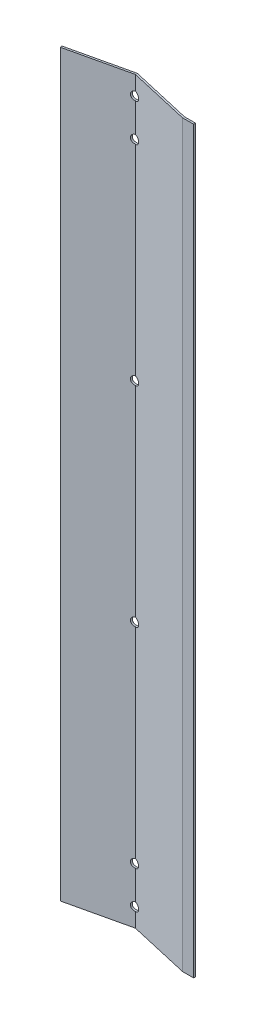
ISO-10303-21;
HEADER;
FILE_DESCRIPTION(('STEP AP214'),'2;1');
FILE_NAME('part.step','',(''),(''),'','','');
FILE_SCHEMA(('AUTOMOTIVE_DESIGN { 1 0 10303 214 1 1 1 1 }'));
ENDSEC;
DATA;
#1=APPLICATION_CONTEXT('core data for automotive mechanical design processes');
#2=APPLICATION_PROTOCOL_DEFINITION('international standard','automotive_design',2000,#1);
#3=PRODUCT_CONTEXT('',#1,'mechanical');
#4=PRODUCT('Part','Part','',(#3));
#5=PRODUCT_RELATED_PRODUCT_CATEGORY('part','',(#4));
#6=PRODUCT_DEFINITION_FORMATION('','',#4);
#7=PRODUCT_DEFINITION_CONTEXT('part definition',#1,'design');
#8=PRODUCT_DEFINITION('design','',#6,#7);
#9=PRODUCT_DEFINITION_SHAPE('','',#8);
#10=(LENGTH_UNIT() NAMED_UNIT(*) SI_UNIT(.MILLI.,.METRE.));
#11=(NAMED_UNIT(*) PLANE_ANGLE_UNIT() SI_UNIT($,.RADIAN.));
#12=(NAMED_UNIT(*) SI_UNIT($,.STERADIAN.) SOLID_ANGLE_UNIT());
#13=UNCERTAINTY_MEASURE_WITH_UNIT(LENGTH_MEASURE(1.E-05),#10,'distance_accuracy_value','');
#14=(GEOMETRIC_REPRESENTATION_CONTEXT(3) GLOBAL_UNCERTAINTY_ASSIGNED_CONTEXT((#13)) GLOBAL_UNIT_ASSIGNED_CONTEXT((#10,
#11,#12)) REPRESENTATION_CONTEXT('',''));
#15=CARTESIAN_POINT('',(0.,0.,0.));
#16=DIRECTION('',(0.,0.,1.));
#17=DIRECTION('',(1.,0.,0.));
#18=AXIS2_PLACEMENT_3D('',#15,#16,#17);
#19=CARTESIAN_POINT('',(-506.627585226793,1975.,994.704780496736));
#20=DIRECTION('',(-1.,0.,0.));
#21=DIRECTION('',(0.,0.,1.));
#22=AXIS2_PLACEMENT_3D('',#19,#20,#21);
#23=PLANE('',#22);
#24=DIRECTION('',(0.,0.,-1.));
#25=VECTOR('',#24,1.);
#26=CARTESIAN_POINT('',(-506.627585226793,0.,994.704780496736));
#27=LINE('',#26,#25);
#28=CARTESIAN_POINT('',(-506.627585226793,0.,999.704780496736));
#29=VERTEX_POINT('',#28);
#30=CARTESIAN_POINT('',(-506.627585226793,0.,994.704780496736));
#31=VERTEX_POINT('',#30);
#32=EDGE_CURVE('E291',#29,#31,#27,.T.);
#33=ORIENTED_EDGE('',*,*,#32,.T.);
#34=DIRECTION('',(0.,-1.,0.));
#35=VECTOR('',#34,1.);
#36=CARTESIAN_POINT('',(-506.627585226793,1975.,994.704780496736));
#37=LINE('',#36,#35);
#38=CARTESIAN_POINT('',(-506.627585226793,1975.,994.704780496736));
#39=VERTEX_POINT('',#38);
#40=EDGE_CURVE('E205',#39,#31,#37,.T.);
#41=ORIENTED_EDGE('',*,*,#40,.F.);
#42=DIRECTION('',(0.,0.,-1.));
#43=VECTOR('',#42,1.);
#44=CARTESIAN_POINT('',(-506.627585226793,1975.,994.704780496736));
#45=LINE('',#44,#43);
#46=CARTESIAN_POINT('',(-506.627585226793,1975.,999.704780496736));
#47=VERTEX_POINT('',#46);
#48=EDGE_CURVE('E292',#47,#39,#45,.T.);
#49=ORIENTED_EDGE('',*,*,#48,.F.);
#50=DIRECTION('',(0.,-1.,0.));
#51=VECTOR('',#50,1.);
#52=CARTESIAN_POINT('',(-506.627585226793,1975.,999.704780496736));
#53=LINE('',#52,#51);
#54=EDGE_CURVE('E310',#47,#29,#53,.T.);
#55=ORIENTED_EDGE('',*,*,#54,.T.);
#56=EDGE_LOOP('',(#33,#41,#49,#55));
#57=FACE_BOUND('',#56,.T.);
#58=ADVANCED_FACE('F33',(#57),#23,.F.);
#59=CARTESIAN_POINT('',(-536.087738825627,1975.,994.704780496736));
#60=DIRECTION('',(0.,0.,1.));
#61=DIRECTION('',(1.,0.,0.));
#62=AXIS2_PLACEMENT_3D('',#59,#60,#61);
#63=PLANE('',#62);
#64=DIRECTION('',(-1.,0.,0.));
#65=VECTOR('',#64,1.);
#66=CARTESIAN_POINT('',(-536.087738825627,0.,994.704780496736));
#67=LINE('',#66,#65);
#68=CARTESIAN_POINT('',(-536.087738825627,0.,994.704780496736));
#69=VERTEX_POINT('',#68);
#70=EDGE_CURVE('E313',#31,#69,#67,.T.);
#71=ORIENTED_EDGE('',*,*,#70,.T.);
#72=DIRECTION('',(0.,-1.,0.));
#73=VECTOR('',#72,1.);
#74=CARTESIAN_POINT('',(-536.087738825627,1975.,994.704780496736));
#75=LINE('',#74,#73);
#76=CARTESIAN_POINT('',(-536.087738825627,1975.,994.704780496736));
#77=VERTEX_POINT('',#76);
#78=EDGE_CURVE('E199',#77,#69,#75,.T.);
#79=ORIENTED_EDGE('',*,*,#78,.F.);
#80=DIRECTION('',(-1.,0.,0.));
#81=VECTOR('',#80,1.);
#82=CARTESIAN_POINT('',(-536.087738825627,1975.,994.704780496736));
#83=LINE('',#82,#81);
#84=EDGE_CURVE('E295',#39,#77,#83,.T.);
#85=ORIENTED_EDGE('',*,*,#84,.F.);
#86=ORIENTED_EDGE('',*,*,#40,.T.);
#87=EDGE_LOOP('',(#71,#79,#85,#86));
#88=FACE_BOUND('',#87,.T.);
#89=ADVANCED_FACE('F361',(#88),#63,.F.);
#90=CARTESIAN_POINT('',(-699.627585226793,1975.,957.225806909489));
#91=DIRECTION('',(-0.223382340793169,0.,0.974730901234676));
#92=DIRECTION('',(0.974730901234677,0.,0.223382340793169));
#93=AXIS2_PLACEMENT_3D('',#90,#91,#92);
#94=PLANE('',#93);
#95=DIRECTION('',(0.,-1.,0.));
#96=VECTOR('',#95,1.);
#97=CARTESIAN_POINT('',(-699.627585226793,1975.,957.225806909489));
#98=LINE('',#97,#96);
#99=CARTESIAN_POINT('',(-699.627585226793,1914.,957.225806909489));
#100=VERTEX_POINT('',#99);
#101=CARTESIAN_POINT('',(-699.627585226793,1836.,957.225806909489));
#102=VERTEX_POINT('',#101);
#103=EDGE_CURVE('E194',#100,#102,#98,.T.);
#104=ORIENTED_EDGE('',*,*,#103,.F.);
#105=CARTESIAN_POINT('',(-699.627585226793,1925.,957.225806909489));
#106=DIRECTION('',(-0.223382340793169,0.,0.974730901234676));
#107=DIRECTION('',(-0.974730901234677,0.,-0.223382340793169));
#108=AXIS2_PLACEMENT_3D('',#105,#106,#107);
#109=ELLIPSE('',#108,11.2851659735692,11.);
#110=CARTESIAN_POINT('',(-699.627585226793,1936.,957.225806909489));
#111=VERTEX_POINT('',#110);
#112=EDGE_CURVE('E288',#100,#111,#109,.T.);
#113=ORIENTED_EDGE('',*,*,#112,.T.);
#114=CARTESIAN_POINT('',(-699.627585226793,1975.,957.225806909489));
#115=VERTEX_POINT('',#114);
#116=EDGE_CURVE('E196',#115,#111,#98,.T.);
#117=ORIENTED_EDGE('',*,*,#116,.F.);
#118=DIRECTION('',(-0.974730901234676,0.,-0.223382340793169));
#119=VECTOR('',#118,1.);
#120=CARTESIAN_POINT('',(-699.627585226793,1975.,957.225806909489));
#121=LINE('',#120,#119);
#122=EDGE_CURVE('E298',#77,#115,#121,.T.);
#123=ORIENTED_EDGE('',*,*,#122,.F.);
#124=ORIENTED_EDGE('',*,*,#78,.T.);
#125=DIRECTION('',(-0.974730901234676,0.,-0.223382340793169));
#126=VECTOR('',#125,1.);
#127=CARTESIAN_POINT('',(-699.627585226793,0.,957.225806909489));
#128=LINE('',#127,#126);
#129=CARTESIAN_POINT('',(-699.627585226793,0.,957.225806909489));
#130=VERTEX_POINT('',#129);
#131=EDGE_CURVE('E315',#69,#130,#128,.T.);
#132=ORIENTED_EDGE('',*,*,#131,.T.);
#133=CARTESIAN_POINT('',(-699.627585226793,39.0000000000004,957.225806909489));
#134=VERTEX_POINT('',#133);
#135=EDGE_CURVE('E200',#134,#130,#98,.T.);
#136=ORIENTED_EDGE('',*,*,#135,.F.);
#137=CARTESIAN_POINT('',(-699.627585226793,50.,957.225806909489));
#138=DIRECTION('',(-0.223382340793169,0.,0.974730901234676));
#139=DIRECTION('',(-0.974730901234677,0.,-0.223382340793169));
#140=AXIS2_PLACEMENT_3D('',#137,#138,#139);
#141=ELLIPSE('',#140,11.2851659735692,11.);
#142=CARTESIAN_POINT('',(-699.627585226793,61.0000000000001,957.225806909489));
#143=VERTEX_POINT('',#142);
#144=EDGE_CURVE('E46',#134,#143,#141,.T.);
#145=ORIENTED_EDGE('',*,*,#144,.T.);
#146=CARTESIAN_POINT('',(-699.627585226793,139.,957.225806909489));
#147=VERTEX_POINT('',#146);
#148=EDGE_CURVE('E195',#147,#143,#98,.T.);
#149=ORIENTED_EDGE('',*,*,#148,.F.);
#150=CARTESIAN_POINT('',(-699.627585226793,150.,957.225806909489));
#151=DIRECTION('',(-0.223382340793169,0.,0.974730901234676));
#152=DIRECTION('',(-0.974730901234677,0.,-0.223382340793169));
#153=AXIS2_PLACEMENT_3D('',#150,#151,#152);
#154=ELLIPSE('',#153,11.2851659735692,11.);
#155=CARTESIAN_POINT('',(-699.627585226793,161.,957.225806909489));
#156=VERTEX_POINT('',#155);
#157=EDGE_CURVE('E53',#147,#156,#154,.T.);
#158=ORIENTED_EDGE('',*,*,#157,.T.);
#159=CARTESIAN_POINT('',(-699.627585226793,697.333,957.225806909489));
#160=VERTEX_POINT('',#159);
#161=EDGE_CURVE('E184',#160,#156,#98,.T.);
#162=ORIENTED_EDGE('',*,*,#161,.F.);
#163=CARTESIAN_POINT('',(-699.627585226793,708.333,957.225806909489));
#164=DIRECTION('',(-0.223382340793169,0.,0.974730901234676));
#165=DIRECTION('',(-0.974730901234677,0.,-0.223382340793169));
#166=AXIS2_PLACEMENT_3D('',#163,#164,#165);
#167=ELLIPSE('',#166,11.2851659735692,11.);
#168=CARTESIAN_POINT('',(-699.627585226793,719.333,957.225806909489));
#169=VERTEX_POINT('',#168);
#170=EDGE_CURVE('E171',#160,#169,#167,.T.);
#171=ORIENTED_EDGE('',*,*,#170,.T.);
#172=CARTESIAN_POINT('',(-699.627585226793,1255.66633,957.225806909489));
#173=VERTEX_POINT('',#172);
#174=EDGE_CURVE('E183',#173,#169,#98,.T.);
#175=ORIENTED_EDGE('',*,*,#174,.F.);
#176=CARTESIAN_POINT('',(-699.627585226793,1266.66633,957.225806909489));
#177=DIRECTION('',(-0.223382340793169,0.,0.974730901234676));
#178=DIRECTION('',(-0.974730901234677,0.,-0.223382340793169));
#179=AXIS2_PLACEMENT_3D('',#176,#177,#178);
#180=ELLIPSE('',#179,11.2851659735692,11.);
#181=CARTESIAN_POINT('',(-699.627585226793,1277.66633,957.225806909489));
#182=VERTEX_POINT('',#181);
#183=EDGE_CURVE('E280',#173,#182,#180,.T.);
#184=ORIENTED_EDGE('',*,*,#183,.T.);
#185=CARTESIAN_POINT('',(-699.627585226793,1814.,957.225806909489));
#186=VERTEX_POINT('',#185);
#187=EDGE_CURVE('E192',#186,#182,#98,.T.);
#188=ORIENTED_EDGE('',*,*,#187,.F.);
#189=CARTESIAN_POINT('',(-699.627585226793,1825.,957.225806909489));
#190=DIRECTION('',(-0.223382340793169,0.,0.974730901234676));
#191=DIRECTION('',(-0.974730901234677,0.,-0.223382340793169));
#192=AXIS2_PLACEMENT_3D('',#189,#190,#191);
#193=ELLIPSE('',#192,11.2851659735692,11.);
#194=EDGE_CURVE('E275',#186,#102,#193,.T.);
#195=ORIENTED_EDGE('',*,*,#194,.T.);
#196=EDGE_LOOP('',(#104,#113,#117,#123,#124,#132,#136,#145,#149,#158,#162,#171,#175,#184,#188,#195));
#197=FACE_BOUND('',#196,.T.);
#198=ADVANCED_FACE('F181',(#197),#94,.F.);
#199=CARTESIAN_POINT('',(-863.694836688782,1975.,994.820010868915));
#200=DIRECTION('',(0.223350522964437,0.,0.974738192486327));
#201=DIRECTION('',(0.974738192486327,0.,-0.223350522964437));
#202=AXIS2_PLACEMENT_3D('',#199,#200,#201);
#203=PLANE('',#202);
#204=ORIENTED_EDGE('',*,*,#116,.T.);
#205=CARTESIAN_POINT('',(-699.627585226793,1925.,957.225806909489));
#206=DIRECTION('',(0.223350522964437,0.,0.974738192486327));
#207=DIRECTION('',(0.974738192486327,0.,-0.223350522964437));
#208=AXIS2_PLACEMENT_3D('',#205,#206,#207);
#209=ELLIPSE('',#208,11.2850815580968,11.);
#210=EDGE_CURVE('E285',#111,#100,#209,.T.);
#211=ORIENTED_EDGE('',*,*,#210,.T.);
#212=ORIENTED_EDGE('',*,*,#103,.T.);
#213=CARTESIAN_POINT('',(-699.627585226793,1825.,957.225806909489));
#214=DIRECTION('',(0.223350522964437,0.,0.974738192486327));
#215=DIRECTION('',(0.974738192486327,0.,-0.223350522964437));
#216=AXIS2_PLACEMENT_3D('',#213,#214,#215);
#217=ELLIPSE('',#216,11.2850815580968,11.);
#218=EDGE_CURVE('E267',#102,#186,#217,.T.);
#219=ORIENTED_EDGE('',*,*,#218,.T.);
#220=ORIENTED_EDGE('',*,*,#187,.T.);
#221=CARTESIAN_POINT('',(-699.627585226793,1266.66633,957.225806909489));
#222=DIRECTION('',(0.223350522964437,0.,0.974738192486327));
#223=DIRECTION('',(0.974738192486327,0.,-0.223350522964437));
#224=AXIS2_PLACEMENT_3D('',#221,#222,#223);
#225=ELLIPSE('',#224,11.2850815580968,11.);
#226=EDGE_CURVE('E191',#182,#173,#225,.T.);
#227=ORIENTED_EDGE('',*,*,#226,.T.);
#228=ORIENTED_EDGE('',*,*,#174,.T.);
#229=CARTESIAN_POINT('',(-699.627585226793,708.333,957.225806909489));
#230=DIRECTION('',(0.223350522964437,0.,0.974738192486327));
#231=DIRECTION('',(0.974738192486327,0.,-0.223350522964437));
#232=AXIS2_PLACEMENT_3D('',#229,#230,#231);
#233=ELLIPSE('',#232,11.2850815580968,11.);
#234=EDGE_CURVE('E168',#169,#160,#233,.T.);
#235=ORIENTED_EDGE('',*,*,#234,.T.);
#236=ORIENTED_EDGE('',*,*,#161,.T.);
#237=CARTESIAN_POINT('',(-699.627585226793,150.,957.225806909489));
#238=DIRECTION('',(0.223350522964437,0.,0.974738192486327));
#239=DIRECTION('',(0.974738192486327,0.,-0.223350522964437));
#240=AXIS2_PLACEMENT_3D('',#237,#238,#239);
#241=ELLIPSE('',#240,11.2850815580968,11.);
#242=EDGE_CURVE('E263',#156,#147,#241,.T.);
#243=ORIENTED_EDGE('',*,*,#242,.T.);
#244=ORIENTED_EDGE('',*,*,#148,.T.);
#245=CARTESIAN_POINT('',(-699.627585226793,50.,957.225806909489));
#246=DIRECTION('',(0.223350522964437,0.,0.974738192486327));
#247=DIRECTION('',(0.974738192486327,0.,-0.223350522964437));
#248=AXIS2_PLACEMENT_3D('',#245,#246,#247);
#249=ELLIPSE('',#248,11.2850815580968,11.);
#250=EDGE_CURVE('E262',#143,#134,#249,.T.);
#251=ORIENTED_EDGE('',*,*,#250,.T.);
#252=ORIENTED_EDGE('',*,*,#135,.T.);
#253=DIRECTION('',(-0.974738192486327,0.,0.223350522964437));
#254=VECTOR('',#253,1.);
#255=CARTESIAN_POINT('',(-863.694836688782,0.,994.820010868915));
#256=LINE('',#255,#254);
#257=CARTESIAN_POINT('',(-863.694836688782,0.,994.820010868915));
#258=VERTEX_POINT('',#257);
#259=EDGE_CURVE('E317',#130,#258,#256,.T.);
#260=ORIENTED_EDGE('',*,*,#259,.T.);
#261=DIRECTION('',(0.,-1.,0.));
#262=VECTOR('',#261,1.);
#263=CARTESIAN_POINT('',(-863.694836688782,1975.,994.820010868915));
#264=LINE('',#263,#262);
#265=CARTESIAN_POINT('',(-863.694836688782,1975.,994.820010868915));
#266=VERTEX_POINT('',#265);
#267=EDGE_CURVE('E201',#266,#258,#264,.T.);
#268=ORIENTED_EDGE('',*,*,#267,.F.);
#269=DIRECTION('',(-0.974738192486327,0.,0.223350522964437));
#270=VECTOR('',#269,1.);
#271=CARTESIAN_POINT('',(-863.694836688782,1975.,994.820010868915));
#272=LINE('',#271,#270);
#273=EDGE_CURVE('E300',#115,#266,#272,.T.);
#274=ORIENTED_EDGE('',*,*,#273,.F.);
#275=EDGE_LOOP('',(#204,#211,#212,#219,#220,#227,#228,#235,#236,#243,#244,#251,#252,#260,#268,#274));
#276=FACE_BOUND('',#275,.T.);
#277=ADVANCED_FACE('F189',(#276),#203,.F.);
#278=CARTESIAN_POINT('',(-862.627585226793,1975.,999.704780496736));
#279=DIRECTION('',(0.976953925564228,0.,-0.213450292397655));
#280=DIRECTION('',(-0.213450292397655,0.,-0.976953925564228));
#281=AXIS2_PLACEMENT_3D('',#278,#279,#280);
#282=PLANE('',#281);
#283=DIRECTION('',(0.213450292397655,0.,0.976953925564228));
#284=VECTOR('',#283,1.);
#285=CARTESIAN_POINT('',(-862.627585226793,0.,999.704780496736));
#286=LINE('',#285,#284);
#287=CARTESIAN_POINT('',(-862.627585226793,0.,999.704780496736));
#288=VERTEX_POINT('',#287);
#289=EDGE_CURVE('E319',#258,#288,#286,.T.);
#290=ORIENTED_EDGE('',*,*,#289,.T.);
#291=DIRECTION('',(0.,-1.,0.));
#292=VECTOR('',#291,1.);
#293=CARTESIAN_POINT('',(-862.627585226793,1975.,999.704780496736));
#294=LINE('',#293,#292);
#295=CARTESIAN_POINT('',(-862.627585226793,1975.,999.704780496736));
#296=VERTEX_POINT('',#295);
#297=EDGE_CURVE('E244',#296,#288,#294,.T.);
#298=ORIENTED_EDGE('',*,*,#297,.F.);
#299=DIRECTION('',(0.213450292397655,0.,0.976953925564228));
#300=VECTOR('',#299,1.);
#301=CARTESIAN_POINT('',(-862.627585226793,1975.,999.704780496736));
#302=LINE('',#301,#300);
#303=EDGE_CURVE('E302',#266,#296,#302,.T.);
#304=ORIENTED_EDGE('',*,*,#303,.F.);
#305=ORIENTED_EDGE('',*,*,#267,.T.);
#306=EDGE_LOOP('',(#290,#298,#304,#305));
#307=FACE_BOUND('',#306,.T.);
#308=ADVANCED_FACE('F390',(#307),#282,.F.);
#309=CARTESIAN_POINT('',(-699.627585226793,1975.,962.343755534459));
#310=DIRECTION('',(-0.223415121692305,0.,-0.974723388146202));
#311=DIRECTION('',(-0.974723388146202,0.,0.223415121692305));
#312=AXIS2_PLACEMENT_3D('',#309,#310,#311);
#313=PLANE('',#312);
#314=DIRECTION('',(0.,-1.,0.));
#315=VECTOR('',#314,1.);
#316=CARTESIAN_POINT('',(-699.627585226793,1975.,962.343755534459));
#317=LINE('',#316,#315);
#318=CARTESIAN_POINT('',(-699.627585226793,1914.,962.343755534459));
#319=VERTEX_POINT('',#318);
#320=CARTESIAN_POINT('',(-699.627585226793,1836.,962.343755534459));
#321=VERTEX_POINT('',#320);
#322=EDGE_CURVE('E239',#319,#321,#317,.T.);
#323=ORIENTED_EDGE('',*,*,#322,.F.);
#324=CARTESIAN_POINT('',(-699.627585226793,1925.,962.343755534459));
#325=DIRECTION('',(-0.223415121692305,0.,-0.974723388146202));
#326=DIRECTION('',(0.974723388146202,0.,-0.223415121692305));
#327=AXIS2_PLACEMENT_3D('',#324,#325,#326);
#328=ELLIPSE('',#327,11.2852529587093,11.);
#329=CARTESIAN_POINT('',(-699.627585226793,1936.,962.343755534459));
#330=VERTEX_POINT('',#329);
#331=EDGE_CURVE('E282',#319,#330,#328,.T.);
#332=ORIENTED_EDGE('',*,*,#331,.T.);
#333=CARTESIAN_POINT('',(-699.627585226793,1975.,962.343755534459));
#334=VERTEX_POINT('',#333);
#335=EDGE_CURVE('E242',#334,#330,#317,.T.);
#336=ORIENTED_EDGE('',*,*,#335,.F.);
#337=DIRECTION('',(0.974723388146203,0.,-0.223415121692305));
#338=VECTOR('',#337,1.);
#339=CARTESIAN_POINT('',(-699.627585226793,1975.,962.343755534459));
#340=LINE('',#339,#338);
#341=EDGE_CURVE('E304',#296,#334,#340,.T.);
#342=ORIENTED_EDGE('',*,*,#341,.F.);
#343=ORIENTED_EDGE('',*,*,#297,.T.);
#344=DIRECTION('',(0.974723388146203,0.,-0.223415121692305));
#345=VECTOR('',#344,1.);
#346=CARTESIAN_POINT('',(-699.627585226793,0.,962.343755534459));
#347=LINE('',#346,#345);
#348=CARTESIAN_POINT('',(-699.627585226793,0.,962.343755534459));
#349=VERTEX_POINT('',#348);
#350=EDGE_CURVE('E321',#288,#349,#347,.T.);
#351=ORIENTED_EDGE('',*,*,#350,.T.);
#352=CARTESIAN_POINT('',(-699.627585226793,39.0000000000008,962.343755534459));
#353=VERTEX_POINT('',#352);
#354=EDGE_CURVE('E245',#353,#349,#317,.T.);
#355=ORIENTED_EDGE('',*,*,#354,.F.);
#356=CARTESIAN_POINT('',(-699.627585226793,50.,962.343755534459));
#357=DIRECTION('',(-0.223415121692305,0.,-0.974723388146202));
#358=DIRECTION('',(0.974723388146202,0.,-0.223415121692305));
#359=AXIS2_PLACEMENT_3D('',#356,#357,#358);
#360=ELLIPSE('',#359,11.2852529587092,11.);
#361=CARTESIAN_POINT('',(-699.627585226793,61.0000000000011,962.343755534459));
#362=VERTEX_POINT('',#361);
#363=EDGE_CURVE('E269',#353,#362,#360,.T.);
#364=ORIENTED_EDGE('',*,*,#363,.T.);
#365=CARTESIAN_POINT('',(-699.627585226793,139.000000000001,962.343755534459));
#366=VERTEX_POINT('',#365);
#367=EDGE_CURVE('E241',#366,#362,#317,.T.);
#368=ORIENTED_EDGE('',*,*,#367,.F.);
#369=CARTESIAN_POINT('',(-699.627585226793,150.,962.343755534459));
#370=DIRECTION('',(-0.223415121692305,0.,-0.974723388146202));
#371=DIRECTION('',(0.974723388146202,0.,-0.223415121692305));
#372=AXIS2_PLACEMENT_3D('',#369,#370,#371);
#373=ELLIPSE('',#372,11.2852529587093,11.);
#374=CARTESIAN_POINT('',(-699.627585226793,161.000000000001,962.343755534459));
#375=VERTEX_POINT('',#374);
#376=EDGE_CURVE('E185',#366,#375,#373,.T.);
#377=ORIENTED_EDGE('',*,*,#376,.T.);
#378=CARTESIAN_POINT('',(-699.627585226793,697.333000000001,962.343755534459));
#379=VERTEX_POINT('',#378);
#380=EDGE_CURVE('E237',#379,#375,#317,.T.);
#381=ORIENTED_EDGE('',*,*,#380,.F.);
#382=CARTESIAN_POINT('',(-699.627585226793,708.333,962.343755534459));
#383=DIRECTION('',(-0.223415121692305,0.,-0.974723388146202));
#384=DIRECTION('',(0.974723388146202,0.,-0.223415121692305));
#385=AXIS2_PLACEMENT_3D('',#382,#383,#384);
#386=ELLIPSE('',#385,11.2852529587093,11.);
#387=CARTESIAN_POINT('',(-699.627585226793,719.333000000001,962.343755534459));
#388=VERTEX_POINT('',#387);
#389=EDGE_CURVE('E176',#379,#388,#386,.T.);
#390=ORIENTED_EDGE('',*,*,#389,.T.);
#391=CARTESIAN_POINT('',(-699.627585226793,1255.66633,962.343755534459));
#392=VERTEX_POINT('',#391);
#393=EDGE_CURVE('E226',#392,#388,#317,.T.);
#394=ORIENTED_EDGE('',*,*,#393,.F.);
#395=CARTESIAN_POINT('',(-699.627585226793,1266.66633,962.343755534459));
#396=DIRECTION('',(-0.223415121692305,0.,-0.974723388146202));
#397=DIRECTION('',(0.974723388146202,0.,-0.223415121692305));
#398=AXIS2_PLACEMENT_3D('',#395,#396,#397);
#399=ELLIPSE('',#398,11.2852529587093,11.);
#400=CARTESIAN_POINT('',(-699.627585226793,1277.66633,962.343755534459));
#401=VERTEX_POINT('',#400);
#402=EDGE_CURVE('E235',#392,#401,#399,.T.);
#403=ORIENTED_EDGE('',*,*,#402,.T.);
#404=CARTESIAN_POINT('',(-699.627585226793,1814.,962.343755534459));
#405=VERTEX_POINT('',#404);
#406=EDGE_CURVE('E228',#405,#401,#317,.T.);
#407=ORIENTED_EDGE('',*,*,#406,.F.);
#408=CARTESIAN_POINT('',(-699.627585226793,1825.,962.343755534459));
#409=DIRECTION('',(-0.223415121692305,0.,-0.974723388146202));
#410=DIRECTION('',(0.974723388146202,0.,-0.223415121692305));
#411=AXIS2_PLACEMENT_3D('',#408,#409,#410);
#412=ELLIPSE('',#411,11.2852529587093,11.);
#413=EDGE_CURVE('E264',#405,#321,#412,.T.);
#414=ORIENTED_EDGE('',*,*,#413,.T.);
#415=EDGE_LOOP('',(#323,#332,#336,#342,#343,#351,#355,#364,#368,#377,#381,#390,#394,#403,#407,#414));
#416=FACE_BOUND('',#415,.T.);
#417=ADVANCED_FACE('F234',(#416),#313,.F.);
#418=CARTESIAN_POINT('',(-536.627585226793,1975.,999.704780496736));
#419=DIRECTION('',(0.223415121692307,0.,-0.974723388146202));
#420=DIRECTION('',(-0.974723388146202,0.,-0.223415121692307));
#421=AXIS2_PLACEMENT_3D('',#418,#419,#420);
#422=PLANE('',#421);
#423=ORIENTED_EDGE('',*,*,#335,.T.);
#424=CARTESIAN_POINT('',(-699.627585226793,1925.,962.343755534459));
#425=DIRECTION('',(0.223415121692307,0.,-0.974723388146202));
#426=DIRECTION('',(-0.974723388146202,0.,-0.223415121692307));
#427=AXIS2_PLACEMENT_3D('',#424,#425,#426);
#428=ELLIPSE('',#427,11.2852529587093,11.);
#429=EDGE_CURVE('E11',#330,#319,#428,.T.);
#430=ORIENTED_EDGE('',*,*,#429,.T.);
#431=ORIENTED_EDGE('',*,*,#322,.T.);
#432=CARTESIAN_POINT('',(-699.627585226793,1825.,962.343755534459));
#433=DIRECTION('',(0.223415121692307,0.,-0.974723388146202));
#434=DIRECTION('',(-0.974723388146202,0.,-0.223415121692307));
#435=AXIS2_PLACEMENT_3D('',#432,#433,#434);
#436=ELLIPSE('',#435,11.2852529587093,11.);
#437=EDGE_CURVE('E217',#321,#405,#436,.T.);
#438=ORIENTED_EDGE('',*,*,#437,.T.);
#439=ORIENTED_EDGE('',*,*,#406,.T.);
#440=CARTESIAN_POINT('',(-699.627585226793,1266.66633,962.343755534459));
#441=DIRECTION('',(0.223415121692307,0.,-0.974723388146202));
#442=DIRECTION('',(-0.974723388146202,0.,-0.223415121692307));
#443=AXIS2_PLACEMENT_3D('',#440,#441,#442);
#444=ELLIPSE('',#443,11.2852529587093,11.);
#445=EDGE_CURVE('E40',#401,#392,#444,.T.);
#446=ORIENTED_EDGE('',*,*,#445,.T.);
#447=ORIENTED_EDGE('',*,*,#393,.T.);
#448=CARTESIAN_POINT('',(-699.627585226793,708.333,962.343755534459));
#449=DIRECTION('',(0.223415121692307,0.,-0.974723388146202));
#450=DIRECTION('',(-0.974723388146202,0.,-0.223415121692307));
#451=AXIS2_PLACEMENT_3D('',#448,#449,#450);
#452=ELLIPSE('',#451,11.2852529587093,11.);
#453=EDGE_CURVE('E208',#388,#379,#452,.T.);
#454=ORIENTED_EDGE('',*,*,#453,.T.);
#455=ORIENTED_EDGE('',*,*,#380,.T.);
#456=CARTESIAN_POINT('',(-699.627585226793,150.,962.343755534459));
#457=DIRECTION('',(0.223415121692307,0.,-0.974723388146202));
#458=DIRECTION('',(-0.974723388146202,0.,-0.223415121692307));
#459=AXIS2_PLACEMENT_3D('',#456,#457,#458);
#460=ELLIPSE('',#459,11.2852529587093,11.);
#461=EDGE_CURVE('E211',#375,#366,#460,.T.);
#462=ORIENTED_EDGE('',*,*,#461,.T.);
#463=ORIENTED_EDGE('',*,*,#367,.T.);
#464=CARTESIAN_POINT('',(-699.627585226793,50.,962.343755534459));
#465=DIRECTION('',(0.223415121692307,0.,-0.974723388146202));
#466=DIRECTION('',(-0.974723388146202,0.,-0.223415121692307));
#467=AXIS2_PLACEMENT_3D('',#464,#465,#466);
#468=ELLIPSE('',#467,11.2852529587093,11.);
#469=EDGE_CURVE('E214',#362,#353,#468,.T.);
#470=ORIENTED_EDGE('',*,*,#469,.T.);
#471=ORIENTED_EDGE('',*,*,#354,.T.);
#472=DIRECTION('',(0.974723388146202,0.,0.223415121692307));
#473=VECTOR('',#472,1.);
#474=CARTESIAN_POINT('',(-536.627585226793,0.,999.704780496736));
#475=LINE('',#474,#473);
#476=CARTESIAN_POINT('',(-536.627585226793,0.,999.704780496736));
#477=VERTEX_POINT('',#476);
#478=EDGE_CURVE('E323',#349,#477,#475,.T.);
#479=ORIENTED_EDGE('',*,*,#478,.T.);
#480=DIRECTION('',(0.,-1.,0.));
#481=VECTOR('',#480,1.);
#482=CARTESIAN_POINT('',(-536.627585226793,1975.,999.704780496736));
#483=LINE('',#482,#481);
#484=CARTESIAN_POINT('',(-536.627585226793,1975.,999.704780496736));
#485=VERTEX_POINT('',#484);
#486=EDGE_CURVE('E246',#485,#477,#483,.T.);
#487=ORIENTED_EDGE('',*,*,#486,.F.);
#488=DIRECTION('',(0.974723388146202,0.,0.223415121692307));
#489=VECTOR('',#488,1.);
#490=CARTESIAN_POINT('',(-536.627585226793,1975.,999.704780496736));
#491=LINE('',#490,#489);
#492=EDGE_CURVE('E306',#334,#485,#491,.T.);
#493=ORIENTED_EDGE('',*,*,#492,.F.);
#494=EDGE_LOOP('',(#423,#430,#431,#438,#439,#446,#447,#454,#455,#462,#463,#470,#471,#479,#487,#493));
#495=FACE_BOUND('',#494,.T.);
#496=ADVANCED_FACE('F225',(#495),#422,.F.);
#497=CARTESIAN_POINT('',(-506.627585226793,1975.,999.704780496736));
#498=DIRECTION('',(0.,0.,-1.));
#499=DIRECTION('',(-1.,0.,0.));
#500=AXIS2_PLACEMENT_3D('',#497,#498,#499);
#501=PLANE('',#500);
#502=DIRECTION('',(1.,0.,0.));
#503=VECTOR('',#502,1.);
#504=CARTESIAN_POINT('',(-506.627585226793,0.,999.704780496736));
#505=LINE('',#504,#503);
#506=EDGE_CURVE('E296',#477,#29,#505,.T.);
#507=ORIENTED_EDGE('',*,*,#506,.T.);
#508=ORIENTED_EDGE('',*,*,#54,.F.);
#509=DIRECTION('',(1.,0.,0.));
#510=VECTOR('',#509,1.);
#511=CARTESIAN_POINT('',(-506.627585226793,1975.,999.704780496736));
#512=LINE('',#511,#510);
#513=EDGE_CURVE('E308',#485,#47,#512,.T.);
#514=ORIENTED_EDGE('',*,*,#513,.F.);
#515=ORIENTED_EDGE('',*,*,#486,.T.);
#516=EDGE_LOOP('',(#507,#508,#514,#515));
#517=FACE_BOUND('',#516,.T.);
#518=ADVANCED_FACE('F377',(#517),#501,.F.);
#519=CARTESIAN_POINT('',(0.,1975.,0.));
#520=DIRECTION('',(0.,-1.,0.));
#521=DIRECTION('',(0.,0.,-1.));
#522=AXIS2_PLACEMENT_3D('',#519,#520,#521);
#523=PLANE('',#522);
#524=ORIENTED_EDGE('',*,*,#48,.T.);
#525=ORIENTED_EDGE('',*,*,#84,.T.);
#526=ORIENTED_EDGE('',*,*,#122,.T.);
#527=ORIENTED_EDGE('',*,*,#273,.T.);
#528=ORIENTED_EDGE('',*,*,#303,.T.);
#529=ORIENTED_EDGE('',*,*,#341,.T.);
#530=ORIENTED_EDGE('',*,*,#492,.T.);
#531=ORIENTED_EDGE('',*,*,#513,.T.);
#532=EDGE_LOOP('',(#524,#525,#526,#527,#528,#529,#530,#531));
#533=FACE_BOUND('',#532,.T.);
#534=ADVANCED_FACE('F375',(#533),#523,.F.);
#535=CARTESIAN_POINT('',(0.,0.,0.));
#536=DIRECTION('',(0.,-1.,0.));
#537=DIRECTION('',(0.,0.,-1.));
#538=AXIS2_PLACEMENT_3D('',#535,#536,#537);
#539=PLANE('',#538);
#540=ORIENTED_EDGE('',*,*,#32,.F.);
#541=ORIENTED_EDGE('',*,*,#506,.F.);
#542=ORIENTED_EDGE('',*,*,#478,.F.);
#543=ORIENTED_EDGE('',*,*,#350,.F.);
#544=ORIENTED_EDGE('',*,*,#289,.F.);
#545=ORIENTED_EDGE('',*,*,#259,.F.);
#546=ORIENTED_EDGE('',*,*,#131,.F.);
#547=ORIENTED_EDGE('',*,*,#70,.F.);
#548=EDGE_LOOP('',(#540,#541,#542,#543,#544,#545,#546,#547));
#549=FACE_BOUND('',#548,.T.);
#550=ADVANCED_FACE('F368',(#549),#539,.T.);
#551=CARTESIAN_POINT('',(-699.627585226793,708.333,999.704780496736));
#552=DIRECTION('',(0.,0.,-1.));
#553=DIRECTION('',(-1.,0.,0.));
#554=AXIS2_PLACEMENT_3D('',#551,#552,#553);
#555=CYLINDRICAL_SURFACE('',#554,11.);
#556=ORIENTED_EDGE('',*,*,#453,.F.);
#557=ORIENTED_EDGE('',*,*,#389,.F.);
#558=EDGE_LOOP('',(#556,#557));
#559=FACE_BOUND('',#558,.T.);
#560=ORIENTED_EDGE('',*,*,#234,.F.);
#561=ORIENTED_EDGE('',*,*,#170,.F.);
#562=EDGE_LOOP('',(#560,#561));
#563=FACE_BOUND('',#562,.T.);
#564=ADVANCED_FACE('F170',(#559,#563),#555,.F.);
#565=CARTESIAN_POINT('',(-699.627585226793,150.,999.704780496736));
#566=DIRECTION('',(0.,0.,-1.));
#567=DIRECTION('',(-1.,0.,0.));
#568=AXIS2_PLACEMENT_3D('',#565,#566,#567);
#569=CYLINDRICAL_SURFACE('',#568,11.);
#570=ORIENTED_EDGE('',*,*,#461,.F.);
#571=ORIENTED_EDGE('',*,*,#376,.F.);
#572=EDGE_LOOP('',(#570,#571));
#573=FACE_BOUND('',#572,.T.);
#574=ORIENTED_EDGE('',*,*,#242,.F.);
#575=ORIENTED_EDGE('',*,*,#157,.F.);
#576=EDGE_LOOP('',(#574,#575));
#577=FACE_BOUND('',#576,.T.);
#578=ADVANCED_FACE('F348',(#573,#577),#569,.F.);
#579=CARTESIAN_POINT('',(-699.627585226793,50.,999.704780496736));
#580=DIRECTION('',(0.,0.,-1.));
#581=DIRECTION('',(-1.,0.,0.));
#582=AXIS2_PLACEMENT_3D('',#579,#580,#581);
#583=CYLINDRICAL_SURFACE('',#582,11.);
#584=ORIENTED_EDGE('',*,*,#469,.F.);
#585=ORIENTED_EDGE('',*,*,#363,.F.);
#586=EDGE_LOOP('',(#584,#585));
#587=FACE_BOUND('',#586,.T.);
#588=ORIENTED_EDGE('',*,*,#250,.F.);
#589=ORIENTED_EDGE('',*,*,#144,.F.);
#590=EDGE_LOOP('',(#588,#589));
#591=FACE_BOUND('',#590,.T.);
#592=ADVANCED_FACE('F345',(#587,#591),#583,.F.);
#593=CARTESIAN_POINT('',(-699.627585226793,1825.,999.704780496736));
#594=DIRECTION('',(0.,0.,-1.));
#595=DIRECTION('',(-1.,0.,0.));
#596=AXIS2_PLACEMENT_3D('',#593,#594,#595);
#597=CYLINDRICAL_SURFACE('',#596,11.);
#598=ORIENTED_EDGE('',*,*,#437,.F.);
#599=ORIENTED_EDGE('',*,*,#413,.F.);
#600=EDGE_LOOP('',(#598,#599));
#601=FACE_BOUND('',#600,.T.);
#602=ORIENTED_EDGE('',*,*,#218,.F.);
#603=ORIENTED_EDGE('',*,*,#194,.F.);
#604=EDGE_LOOP('',(#602,#603));
#605=FACE_BOUND('',#604,.T.);
#606=ADVANCED_FACE('F347',(#601,#605),#597,.F.);
#607=CARTESIAN_POINT('',(-699.627585226793,1266.66633,999.704780496736));
#608=DIRECTION('',(0.,0.,-1.));
#609=DIRECTION('',(-1.,0.,0.));
#610=AXIS2_PLACEMENT_3D('',#607,#608,#609);
#611=CYLINDRICAL_SURFACE('',#610,11.);
#612=ORIENTED_EDGE('',*,*,#445,.F.);
#613=ORIENTED_EDGE('',*,*,#402,.F.);
#614=EDGE_LOOP('',(#612,#613));
#615=FACE_BOUND('',#614,.T.);
#616=ORIENTED_EDGE('',*,*,#226,.F.);
#617=ORIENTED_EDGE('',*,*,#183,.F.);
#618=EDGE_LOOP('',(#616,#617));
#619=FACE_BOUND('',#618,.T.);
#620=ADVANCED_FACE('F354',(#615,#619),#611,.F.);
#621=CARTESIAN_POINT('',(-699.627585226793,1925.,999.704780496736));
#622=DIRECTION('',(0.,0.,-1.));
#623=DIRECTION('',(-1.,0.,0.));
#624=AXIS2_PLACEMENT_3D('',#621,#622,#623);
#625=CYLINDRICAL_SURFACE('',#624,11.);
#626=ORIENTED_EDGE('',*,*,#429,.F.);
#627=ORIENTED_EDGE('',*,*,#331,.F.);
#628=EDGE_LOOP('',(#626,#627));
#629=FACE_BOUND('',#628,.T.);
#630=ORIENTED_EDGE('',*,*,#210,.F.);
#631=ORIENTED_EDGE('',*,*,#112,.F.);
#632=EDGE_LOOP('',(#630,#631));
#633=FACE_BOUND('',#632,.T.);
#634=ADVANCED_FACE('F446',(#629,#633),#625,.F.);
#635=CLOSED_SHELL('',(#58,#89,#198,#277,#308,#417,#496,#518,#534,#550,#564,#578,#592,#606,#620,#634));
#636=MANIFOLD_SOLID_BREP('B2',#635);
#637=ADVANCED_BREP_SHAPE_REPRESENTATION('',(#18,#636),#14);
#638=SHAPE_DEFINITION_REPRESENTATION(#9,#637);
ENDSEC;
END-ISO-10303-21;
